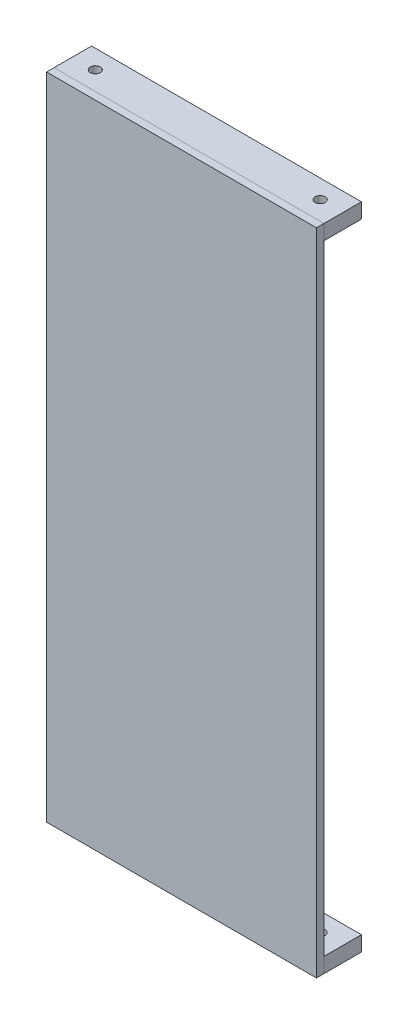
ISO-10303-21;
HEADER;
FILE_DESCRIPTION(('STEP AP214'),'2;1');
FILE_NAME('part.step','',(''),(''),'','','');
FILE_SCHEMA(('AUTOMOTIVE_DESIGN { 1 0 10303 214 1 1 1 1 }'));
ENDSEC;
DATA;
#1=APPLICATION_CONTEXT('core data for automotive mechanical design processes');
#2=APPLICATION_PROTOCOL_DEFINITION('international standard','automotive_design',2000,#1);
#3=PRODUCT_CONTEXT('',#1,'mechanical');
#4=PRODUCT('Part','Part','',(#3));
#5=PRODUCT_RELATED_PRODUCT_CATEGORY('part','',(#4));
#6=PRODUCT_DEFINITION_FORMATION('','',#4);
#7=PRODUCT_DEFINITION_CONTEXT('part definition',#1,'design');
#8=PRODUCT_DEFINITION('design','',#6,#7);
#9=PRODUCT_DEFINITION_SHAPE('','',#8);
#10=(LENGTH_UNIT() NAMED_UNIT(*) SI_UNIT(.MILLI.,.METRE.));
#11=(NAMED_UNIT(*) PLANE_ANGLE_UNIT() SI_UNIT($,.RADIAN.));
#12=(NAMED_UNIT(*) SI_UNIT($,.STERADIAN.) SOLID_ANGLE_UNIT());
#13=UNCERTAINTY_MEASURE_WITH_UNIT(LENGTH_MEASURE(1.E-05),#10,'distance_accuracy_value','');
#14=(GEOMETRIC_REPRESENTATION_CONTEXT(3) GLOBAL_UNCERTAINTY_ASSIGNED_CONTEXT((#13)) GLOBAL_UNIT_ASSIGNED_CONTEXT((#10,
#11,#12)) REPRESENTATION_CONTEXT('',''));
#15=CARTESIAN_POINT('',(0.,0.,0.));
#16=DIRECTION('',(0.,0.,1.));
#17=DIRECTION('',(1.,0.,0.));
#18=AXIS2_PLACEMENT_3D('',#15,#16,#17);
#19=CARTESIAN_POINT('',(54.,-130.,-1.5));
#20=DIRECTION('',(1.,0.,0.));
#21=DIRECTION('',(0.,0.,-1.));
#22=AXIS2_PLACEMENT_3D('',#19,#20,#21);
#23=PLANE('',#22);
#24=DIRECTION('',(0.,0.,-1.));
#25=VECTOR('',#24,1.);
#26=CARTESIAN_POINT('',(54.,-124.,-1.5));
#27=LINE('',#26,#25);
#28=CARTESIAN_POINT('',(54.,-124.,-1.5));
#29=VERTEX_POINT('',#28);
#30=CARTESIAN_POINT('',(54.,-124.,-16.5));
#31=VERTEX_POINT('',#30);
#32=EDGE_CURVE('E113',#29,#31,#27,.T.);
#33=ORIENTED_EDGE('',*,*,#32,.F.);
#34=DIRECTION('',(0.,1.,0.));
#35=VECTOR('',#34,1.);
#36=CARTESIAN_POINT('',(54.,-130.,-1.5));
#37=LINE('',#36,#35);
#38=CARTESIAN_POINT('',(54.,-130.,-1.5));
#39=VERTEX_POINT('',#38);
#40=EDGE_CURVE('E12',#39,#29,#37,.T.);
#41=ORIENTED_EDGE('',*,*,#40,.F.);
#42=DIRECTION('',(0.,0.,-1.));
#43=VECTOR('',#42,1.);
#44=CARTESIAN_POINT('',(54.,-130.,-1.5));
#45=LINE('',#44,#43);
#46=CARTESIAN_POINT('',(54.,-130.,-16.5));
#47=VERTEX_POINT('',#46);
#48=EDGE_CURVE('E106',#39,#47,#45,.T.);
#49=ORIENTED_EDGE('',*,*,#48,.T.);
#50=DIRECTION('',(0.,1.,0.));
#51=VECTOR('',#50,1.);
#52=CARTESIAN_POINT('',(54.,-130.,-16.5));
#53=LINE('',#52,#51);
#54=EDGE_CURVE('E51',#47,#31,#53,.T.);
#55=ORIENTED_EDGE('',*,*,#54,.T.);
#56=EDGE_LOOP('',(#33,#41,#49,#55));
#57=FACE_BOUND('',#56,.T.);
#58=ADVANCED_FACE('F48',(#57),#23,.T.);
#59=CARTESIAN_POINT('',(54.,-130.,-1.5));
#60=DIRECTION('',(0.,0.,1.));
#61=DIRECTION('',(1.,0.,0.));
#62=AXIS2_PLACEMENT_3D('',#59,#60,#61);
#63=PLANE('',#62);
#64=DIRECTION('',(1.,0.,0.));
#65=VECTOR('',#64,1.);
#66=CARTESIAN_POINT('',(54.,-124.,-1.5));
#67=LINE('',#66,#65);
#68=CARTESIAN_POINT('',(-54.,-124.,-1.49999999999999));
#69=VERTEX_POINT('',#68);
#70=EDGE_CURVE('E108',#69,#29,#67,.T.);
#71=ORIENTED_EDGE('',*,*,#70,.F.);
#72=DIRECTION('',(0.,1.,0.));
#73=VECTOR('',#72,1.);
#74=CARTESIAN_POINT('',(-54.,-130.,-1.49999999999999));
#75=LINE('',#74,#73);
#76=CARTESIAN_POINT('',(-54.,-130.,-1.49999999999999));
#77=VERTEX_POINT('',#76);
#78=EDGE_CURVE('E57',#77,#69,#75,.T.);
#79=ORIENTED_EDGE('',*,*,#78,.F.);
#80=DIRECTION('',(1.,0.,0.));
#81=VECTOR('',#80,1.);
#82=CARTESIAN_POINT('',(54.,-130.,-1.5));
#83=LINE('',#82,#81);
#84=EDGE_CURVE('E103',#77,#39,#83,.T.);
#85=ORIENTED_EDGE('',*,*,#84,.T.);
#86=ORIENTED_EDGE('',*,*,#40,.T.);
#87=EDGE_LOOP('',(#71,#79,#85,#86));
#88=FACE_BOUND('',#87,.T.);
#89=ADVANCED_FACE('F124',(#88),#63,.T.);
#90=CARTESIAN_POINT('',(-54.,-130.,-1.49999999999999));
#91=DIRECTION('',(-1.,0.,0.));
#92=DIRECTION('',(0.,0.,1.));
#93=AXIS2_PLACEMENT_3D('',#90,#91,#92);
#94=PLANE('',#93);
#95=DIRECTION('',(0.,0.,1.));
#96=VECTOR('',#95,1.);
#97=CARTESIAN_POINT('',(-54.,-124.,-1.49999999999999));
#98=LINE('',#97,#96);
#99=CARTESIAN_POINT('',(-54.,-124.,-16.5));
#100=VERTEX_POINT('',#99);
#101=EDGE_CURVE('E98',#100,#69,#98,.T.);
#102=ORIENTED_EDGE('',*,*,#101,.F.);
#103=DIRECTION('',(0.,1.,0.));
#104=VECTOR('',#103,1.);
#105=CARTESIAN_POINT('',(-54.,-130.,-16.5));
#106=LINE('',#105,#104);
#107=CARTESIAN_POINT('',(-54.,-130.,-16.5));
#108=VERTEX_POINT('',#107);
#109=EDGE_CURVE('E93',#108,#100,#106,.T.);
#110=ORIENTED_EDGE('',*,*,#109,.F.);
#111=DIRECTION('',(0.,0.,1.));
#112=VECTOR('',#111,1.);
#113=CARTESIAN_POINT('',(-54.,-130.,-1.49999999999999));
#114=LINE('',#113,#112);
#115=EDGE_CURVE('E96',#108,#77,#114,.T.);
#116=ORIENTED_EDGE('',*,*,#115,.T.);
#117=ORIENTED_EDGE('',*,*,#78,.T.);
#118=EDGE_LOOP('',(#102,#110,#116,#117));
#119=FACE_BOUND('',#118,.T.);
#120=ADVANCED_FACE('F95',(#119),#94,.T.);
#121=CARTESIAN_POINT('',(54.,-130.,-16.5));
#122=DIRECTION('',(0.,0.,-1.));
#123=DIRECTION('',(-1.,0.,0.));
#124=AXIS2_PLACEMENT_3D('',#121,#122,#123);
#125=PLANE('',#124);
#126=DIRECTION('',(-1.,0.,0.));
#127=VECTOR('',#126,1.);
#128=CARTESIAN_POINT('',(54.,-124.,-16.5));
#129=LINE('',#128,#127);
#130=EDGE_CURVE('E116',#31,#100,#129,.T.);
#131=ORIENTED_EDGE('',*,*,#130,.F.);
#132=ORIENTED_EDGE('',*,*,#54,.F.);
#133=DIRECTION('',(-1.,0.,0.));
#134=VECTOR('',#133,1.);
#135=CARTESIAN_POINT('',(54.,-130.,-16.5));
#136=LINE('',#135,#134);
#137=EDGE_CURVE('E102',#47,#108,#136,.T.);
#138=ORIENTED_EDGE('',*,*,#137,.T.);
#139=ORIENTED_EDGE('',*,*,#109,.T.);
#140=EDGE_LOOP('',(#131,#132,#138,#139));
#141=FACE_BOUND('',#140,.T.);
#142=ADVANCED_FACE('F105',(#141),#125,.T.);
#143=CARTESIAN_POINT('',(0.,-130.,0.));
#144=DIRECTION('',(0.,1.,0.));
#145=DIRECTION('',(0.,0.,1.));
#146=AXIS2_PLACEMENT_3D('',#143,#144,#145);
#147=PLANE('',#146);
#148=CARTESIAN_POINT('',(-45.,-130.,-8.99999999999999));
#149=DIRECTION('',(0.,1.,0.));
#150=DIRECTION('',(0.,0.,1.));
#151=AXIS2_PLACEMENT_3D('',#148,#149,#150);
#152=CIRCLE('',#151,2.);
#153=CARTESIAN_POINT('',(-45.,-130.,-6.99999999999999));
#154=VERTEX_POINT('',#153);
#155=EDGE_CURVE('E157',#154,#154,#152,.T.);
#156=ORIENTED_EDGE('',*,*,#155,.T.);
#157=EDGE_LOOP('',(#156));
#158=FACE_BOUND('',#157,.T.);
#159=CARTESIAN_POINT('',(45.,-130.,-9.));
#160=DIRECTION('',(0.,1.,0.));
#161=DIRECTION('',(0.,0.,1.));
#162=AXIS2_PLACEMENT_3D('',#159,#160,#161);
#163=CIRCLE('',#162,2.);
#164=CARTESIAN_POINT('',(45.,-130.,-7.));
#165=VERTEX_POINT('',#164);
#166=EDGE_CURVE('E117',#165,#165,#163,.T.);
#167=ORIENTED_EDGE('',*,*,#166,.T.);
#168=EDGE_LOOP('',(#167));
#169=FACE_BOUND('',#168,.T.);
#170=ORIENTED_EDGE('',*,*,#48,.F.);
#171=ORIENTED_EDGE('',*,*,#84,.F.);
#172=ORIENTED_EDGE('',*,*,#115,.F.);
#173=ORIENTED_EDGE('',*,*,#137,.F.);
#174=EDGE_LOOP('',(#170,#171,#172,#173));
#175=FACE_BOUND('',#174,.T.);
#176=ADVANCED_FACE('F101',(#158,#169,#175),#147,.F.);
#177=CARTESIAN_POINT('',(0.,-124.,0.));
#178=DIRECTION('',(0.,1.,0.));
#179=DIRECTION('',(0.,0.,1.));
#180=AXIS2_PLACEMENT_3D('',#177,#178,#179);
#181=PLANE('',#180);
#182=CARTESIAN_POINT('',(-45.,-124.,-8.99999999999999));
#183=DIRECTION('',(0.,1.,0.));
#184=DIRECTION('',(0.,0.,1.));
#185=AXIS2_PLACEMENT_3D('',#182,#183,#184);
#186=CIRCLE('',#185,2.);
#187=CARTESIAN_POINT('',(-45.,-124.,-6.99999999999999));
#188=VERTEX_POINT('',#187);
#189=EDGE_CURVE('E160',#188,#188,#186,.T.);
#190=ORIENTED_EDGE('',*,*,#189,.F.);
#191=EDGE_LOOP('',(#190));
#192=FACE_BOUND('',#191,.T.);
#193=CARTESIAN_POINT('',(45.,-124.,-9.));
#194=DIRECTION('',(0.,1.,0.));
#195=DIRECTION('',(0.,0.,1.));
#196=AXIS2_PLACEMENT_3D('',#193,#194,#195);
#197=CIRCLE('',#196,2.);
#198=CARTESIAN_POINT('',(45.,-124.,-7.));
#199=VERTEX_POINT('',#198);
#200=EDGE_CURVE('E162',#199,#199,#197,.T.);
#201=ORIENTED_EDGE('',*,*,#200,.F.);
#202=EDGE_LOOP('',(#201));
#203=FACE_BOUND('',#202,.T.);
#204=ORIENTED_EDGE('',*,*,#32,.T.);
#205=ORIENTED_EDGE('',*,*,#130,.T.);
#206=ORIENTED_EDGE('',*,*,#101,.T.);
#207=ORIENTED_EDGE('',*,*,#70,.T.);
#208=EDGE_LOOP('',(#204,#205,#206,#207));
#209=FACE_BOUND('',#208,.T.);
#210=ADVANCED_FACE('F123',(#192,#203,#209),#181,.T.);
#211=CARTESIAN_POINT('',(45.,-130.,-9.));
#212=DIRECTION('',(0.,1.,0.));
#213=DIRECTION('',(0.,0.,1.));
#214=AXIS2_PLACEMENT_3D('',#211,#212,#213);
#215=CYLINDRICAL_SURFACE('',#214,2.);
#216=ORIENTED_EDGE('',*,*,#166,.F.);
#217=EDGE_LOOP('',(#216));
#218=FACE_BOUND('',#217,.T.);
#219=ORIENTED_EDGE('',*,*,#200,.T.);
#220=EDGE_LOOP('',(#219));
#221=FACE_BOUND('',#220,.T.);
#222=ADVANCED_FACE('F142',(#218,#221),#215,.F.);
#223=CARTESIAN_POINT('',(-45.,-130.,-8.99999999999999));
#224=DIRECTION('',(0.,1.,0.));
#225=DIRECTION('',(0.,0.,1.));
#226=AXIS2_PLACEMENT_3D('',#223,#224,#225);
#227=CYLINDRICAL_SURFACE('',#226,2.);
#228=ORIENTED_EDGE('',*,*,#155,.F.);
#229=EDGE_LOOP('',(#228));
#230=FACE_BOUND('',#229,.T.);
#231=ORIENTED_EDGE('',*,*,#189,.T.);
#232=EDGE_LOOP('',(#231));
#233=FACE_BOUND('',#232,.T.);
#234=ADVANCED_FACE('F149',(#230,#233),#227,.F.);
#235=CLOSED_SHELL('',(#58,#89,#120,#142,#176,#210,#222,#234));
#236=MANIFOLD_SOLID_BREP('B2',#235);
#237=CARTESIAN_POINT('',(54.,124.,-1.5));
#238=DIRECTION('',(1.,0.,0.));
#239=DIRECTION('',(0.,0.,-1.));
#240=AXIS2_PLACEMENT_3D('',#237,#238,#239);
#241=PLANE('',#240);
#242=DIRECTION('',(0.,0.,-1.));
#243=VECTOR('',#242,1.);
#244=CARTESIAN_POINT('',(54.,130.,-1.5));
#245=LINE('',#244,#243);
#246=CARTESIAN_POINT('',(54.,130.,-1.5));
#247=VERTEX_POINT('',#246);
#248=CARTESIAN_POINT('',(54.,130.,-16.5));
#249=VERTEX_POINT('',#248);
#250=EDGE_CURVE('E288',#247,#249,#245,.T.);
#251=ORIENTED_EDGE('',*,*,#250,.F.);
#252=DIRECTION('',(0.,1.,0.));
#253=VECTOR('',#252,1.);
#254=CARTESIAN_POINT('',(54.,124.,-1.5));
#255=LINE('',#254,#253);
#256=CARTESIAN_POINT('',(54.,124.,-1.5));
#257=VERTEX_POINT('',#256);
#258=EDGE_CURVE('E46',#257,#247,#255,.T.);
#259=ORIENTED_EDGE('',*,*,#258,.F.);
#260=DIRECTION('',(0.,0.,-1.));
#261=VECTOR('',#260,1.);
#262=CARTESIAN_POINT('',(54.,124.,-1.5));
#263=LINE('',#262,#261);
#264=CARTESIAN_POINT('',(54.,124.,-16.5));
#265=VERTEX_POINT('',#264);
#266=EDGE_CURVE('E281',#257,#265,#263,.T.);
#267=ORIENTED_EDGE('',*,*,#266,.T.);
#268=DIRECTION('',(0.,1.,0.));
#269=VECTOR('',#268,1.);
#270=CARTESIAN_POINT('',(54.,124.,-16.5));
#271=LINE('',#270,#269);
#272=EDGE_CURVE('E226',#265,#249,#271,.T.);
#273=ORIENTED_EDGE('',*,*,#272,.T.);
#274=EDGE_LOOP('',(#251,#259,#267,#273));
#275=FACE_BOUND('',#274,.T.);
#276=ADVANCED_FACE('F223',(#275),#241,.T.);
#277=CARTESIAN_POINT('',(54.,124.,-1.5));
#278=DIRECTION('',(0.,0.,1.));
#279=DIRECTION('',(1.,0.,0.));
#280=AXIS2_PLACEMENT_3D('',#277,#278,#279);
#281=PLANE('',#280);
#282=DIRECTION('',(1.,0.,0.));
#283=VECTOR('',#282,1.);
#284=CARTESIAN_POINT('',(54.,130.,-1.5));
#285=LINE('',#284,#283);
#286=CARTESIAN_POINT('',(-54.,130.,-1.49999999999999));
#287=VERTEX_POINT('',#286);
#288=EDGE_CURVE('E283',#287,#247,#285,.T.);
#289=ORIENTED_EDGE('',*,*,#288,.F.);
#290=DIRECTION('',(0.,1.,0.));
#291=VECTOR('',#290,1.);
#292=CARTESIAN_POINT('',(-54.,124.,-1.49999999999999));
#293=LINE('',#292,#291);
#294=CARTESIAN_POINT('',(-54.,124.,-1.49999999999999));
#295=VERTEX_POINT('',#294);
#296=EDGE_CURVE('E232',#295,#287,#293,.T.);
#297=ORIENTED_EDGE('',*,*,#296,.F.);
#298=DIRECTION('',(1.,0.,0.));
#299=VECTOR('',#298,1.);
#300=CARTESIAN_POINT('',(54.,124.,-1.5));
#301=LINE('',#300,#299);
#302=EDGE_CURVE('E278',#295,#257,#301,.T.);
#303=ORIENTED_EDGE('',*,*,#302,.T.);
#304=ORIENTED_EDGE('',*,*,#258,.T.);
#305=EDGE_LOOP('',(#289,#297,#303,#304));
#306=FACE_BOUND('',#305,.T.);
#307=ADVANCED_FACE('F299',(#306),#281,.T.);
#308=CARTESIAN_POINT('',(-54.,124.,-1.49999999999999));
#309=DIRECTION('',(-1.,0.,0.));
#310=DIRECTION('',(0.,0.,1.));
#311=AXIS2_PLACEMENT_3D('',#308,#309,#310);
#312=PLANE('',#311);
#313=DIRECTION('',(0.,0.,1.));
#314=VECTOR('',#313,1.);
#315=CARTESIAN_POINT('',(-54.,130.,-1.49999999999999));
#316=LINE('',#315,#314);
#317=CARTESIAN_POINT('',(-54.,130.,-16.5));
#318=VERTEX_POINT('',#317);
#319=EDGE_CURVE('E273',#318,#287,#316,.T.);
#320=ORIENTED_EDGE('',*,*,#319,.F.);
#321=DIRECTION('',(0.,1.,0.));
#322=VECTOR('',#321,1.);
#323=CARTESIAN_POINT('',(-54.,124.,-16.5));
#324=LINE('',#323,#322);
#325=CARTESIAN_POINT('',(-54.,124.,-16.5));
#326=VERTEX_POINT('',#325);
#327=EDGE_CURVE('E268',#326,#318,#324,.T.);
#328=ORIENTED_EDGE('',*,*,#327,.F.);
#329=DIRECTION('',(0.,0.,1.));
#330=VECTOR('',#329,1.);
#331=CARTESIAN_POINT('',(-54.,124.,-1.49999999999999));
#332=LINE('',#331,#330);
#333=EDGE_CURVE('E271',#326,#295,#332,.T.);
#334=ORIENTED_EDGE('',*,*,#333,.T.);
#335=ORIENTED_EDGE('',*,*,#296,.T.);
#336=EDGE_LOOP('',(#320,#328,#334,#335));
#337=FACE_BOUND('',#336,.T.);
#338=ADVANCED_FACE('F270',(#337),#312,.T.);
#339=CARTESIAN_POINT('',(54.,124.,-16.5));
#340=DIRECTION('',(0.,0.,-1.));
#341=DIRECTION('',(-1.,0.,0.));
#342=AXIS2_PLACEMENT_3D('',#339,#340,#341);
#343=PLANE('',#342);
#344=DIRECTION('',(-1.,0.,0.));
#345=VECTOR('',#344,1.);
#346=CARTESIAN_POINT('',(54.,130.,-16.5));
#347=LINE('',#346,#345);
#348=EDGE_CURVE('E291',#249,#318,#347,.T.);
#349=ORIENTED_EDGE('',*,*,#348,.F.);
#350=ORIENTED_EDGE('',*,*,#272,.F.);
#351=DIRECTION('',(-1.,0.,0.));
#352=VECTOR('',#351,1.);
#353=CARTESIAN_POINT('',(54.,124.,-16.5));
#354=LINE('',#353,#352);
#355=EDGE_CURVE('E277',#265,#326,#354,.T.);
#356=ORIENTED_EDGE('',*,*,#355,.T.);
#357=ORIENTED_EDGE('',*,*,#327,.T.);
#358=EDGE_LOOP('',(#349,#350,#356,#357));
#359=FACE_BOUND('',#358,.T.);
#360=ADVANCED_FACE('F280',(#359),#343,.T.);
#361=CARTESIAN_POINT('',(0.,124.,0.));
#362=DIRECTION('',(0.,1.,0.));
#363=DIRECTION('',(0.,0.,1.));
#364=AXIS2_PLACEMENT_3D('',#361,#362,#363);
#365=PLANE('',#364);
#366=CARTESIAN_POINT('',(-45.,124.,-8.99999999999999));
#367=DIRECTION('',(0.,1.,0.));
#368=DIRECTION('',(0.,0.,1.));
#369=AXIS2_PLACEMENT_3D('',#366,#367,#368);
#370=CIRCLE('',#369,2.);
#371=CARTESIAN_POINT('',(-45.,124.,-6.99999999999999));
#372=VERTEX_POINT('',#371);
#373=EDGE_CURVE('E332',#372,#372,#370,.T.);
#374=ORIENTED_EDGE('',*,*,#373,.T.);
#375=EDGE_LOOP('',(#374));
#376=FACE_BOUND('',#375,.T.);
#377=CARTESIAN_POINT('',(45.,124.,-9.));
#378=DIRECTION('',(0.,1.,0.));
#379=DIRECTION('',(0.,0.,1.));
#380=AXIS2_PLACEMENT_3D('',#377,#378,#379);
#381=CIRCLE('',#380,2.);
#382=CARTESIAN_POINT('',(45.,124.,-7.));
#383=VERTEX_POINT('',#382);
#384=EDGE_CURVE('E292',#383,#383,#381,.T.);
#385=ORIENTED_EDGE('',*,*,#384,.T.);
#386=EDGE_LOOP('',(#385));
#387=FACE_BOUND('',#386,.T.);
#388=ORIENTED_EDGE('',*,*,#266,.F.);
#389=ORIENTED_EDGE('',*,*,#302,.F.);
#390=ORIENTED_EDGE('',*,*,#333,.F.);
#391=ORIENTED_EDGE('',*,*,#355,.F.);
#392=EDGE_LOOP('',(#388,#389,#390,#391));
#393=FACE_BOUND('',#392,.T.);
#394=ADVANCED_FACE('F276',(#376,#387,#393),#365,.F.);
#395=CARTESIAN_POINT('',(0.,130.,0.));
#396=DIRECTION('',(0.,1.,0.));
#397=DIRECTION('',(0.,0.,1.));
#398=AXIS2_PLACEMENT_3D('',#395,#396,#397);
#399=PLANE('',#398);
#400=CARTESIAN_POINT('',(-45.,130.,-8.99999999999999));
#401=DIRECTION('',(0.,1.,0.));
#402=DIRECTION('',(0.,0.,1.));
#403=AXIS2_PLACEMENT_3D('',#400,#401,#402);
#404=CIRCLE('',#403,2.);
#405=CARTESIAN_POINT('',(-45.,130.,-6.99999999999999));
#406=VERTEX_POINT('',#405);
#407=EDGE_CURVE('E335',#406,#406,#404,.T.);
#408=ORIENTED_EDGE('',*,*,#407,.F.);
#409=EDGE_LOOP('',(#408));
#410=FACE_BOUND('',#409,.T.);
#411=CARTESIAN_POINT('',(45.,130.,-9.));
#412=DIRECTION('',(0.,1.,0.));
#413=DIRECTION('',(0.,0.,1.));
#414=AXIS2_PLACEMENT_3D('',#411,#412,#413);
#415=CIRCLE('',#414,2.);
#416=CARTESIAN_POINT('',(45.,130.,-7.));
#417=VERTEX_POINT('',#416);
#418=EDGE_CURVE('E337',#417,#417,#415,.T.);
#419=ORIENTED_EDGE('',*,*,#418,.F.);
#420=EDGE_LOOP('',(#419));
#421=FACE_BOUND('',#420,.T.);
#422=ORIENTED_EDGE('',*,*,#250,.T.);
#423=ORIENTED_EDGE('',*,*,#348,.T.);
#424=ORIENTED_EDGE('',*,*,#319,.T.);
#425=ORIENTED_EDGE('',*,*,#288,.T.);
#426=EDGE_LOOP('',(#422,#423,#424,#425));
#427=FACE_BOUND('',#426,.T.);
#428=ADVANCED_FACE('F298',(#410,#421,#427),#399,.T.);
#429=CARTESIAN_POINT('',(45.,124.,-9.));
#430=DIRECTION('',(0.,1.,0.));
#431=DIRECTION('',(0.,0.,1.));
#432=AXIS2_PLACEMENT_3D('',#429,#430,#431);
#433=CYLINDRICAL_SURFACE('',#432,2.);
#434=ORIENTED_EDGE('',*,*,#384,.F.);
#435=EDGE_LOOP('',(#434));
#436=FACE_BOUND('',#435,.T.);
#437=ORIENTED_EDGE('',*,*,#418,.T.);
#438=EDGE_LOOP('',(#437));
#439=FACE_BOUND('',#438,.T.);
#440=ADVANCED_FACE('F317',(#436,#439),#433,.F.);
#441=CARTESIAN_POINT('',(-45.,124.,-8.99999999999999));
#442=DIRECTION('',(0.,1.,0.));
#443=DIRECTION('',(0.,0.,1.));
#444=AXIS2_PLACEMENT_3D('',#441,#442,#443);
#445=CYLINDRICAL_SURFACE('',#444,2.);
#446=ORIENTED_EDGE('',*,*,#373,.F.);
#447=EDGE_LOOP('',(#446));
#448=FACE_BOUND('',#447,.T.);
#449=ORIENTED_EDGE('',*,*,#407,.T.);
#450=EDGE_LOOP('',(#449));
#451=FACE_BOUND('',#450,.T.);
#452=ADVANCED_FACE('F324',(#448,#451),#445,.F.);
#453=CLOSED_SHELL('',(#276,#307,#338,#360,#394,#428,#440,#452));
#454=MANIFOLD_SOLID_BREP('B6',#453);
#455=CARTESIAN_POINT('',(-54.,-130.,-1.5));
#456=DIRECTION('',(-1.,0.,0.));
#457=DIRECTION('',(0.,0.,1.));
#458=AXIS2_PLACEMENT_3D('',#455,#456,#457);
#459=PLANE('',#458);
#460=DIRECTION('',(0.,0.,1.));
#461=VECTOR('',#460,1.);
#462=CARTESIAN_POINT('',(-54.,-130.,-1.5));
#463=LINE('',#462,#461);
#464=CARTESIAN_POINT('',(-54.,-130.,-1.5));
#465=VERTEX_POINT('',#464);
#466=CARTESIAN_POINT('',(-54.,-130.,1.5));
#467=VERTEX_POINT('',#466);
#468=EDGE_CURVE('E392',#465,#467,#463,.T.);
#469=ORIENTED_EDGE('',*,*,#468,.T.);
#470=DIRECTION('',(0.,-1.,0.));
#471=VECTOR('',#470,1.);
#472=CARTESIAN_POINT('',(-54.,-130.,1.5));
#473=LINE('',#472,#471);
#474=CARTESIAN_POINT('',(-54.,130.,1.5));
#475=VERTEX_POINT('',#474);
#476=EDGE_CURVE('E429',#475,#467,#473,.T.);
#477=ORIENTED_EDGE('',*,*,#476,.F.);
#478=DIRECTION('',(0.,0.,1.));
#479=VECTOR('',#478,1.);
#480=CARTESIAN_POINT('',(-54.,130.,-1.5));
#481=LINE('',#480,#479);
#482=CARTESIAN_POINT('',(-54.,130.,-1.5));
#483=VERTEX_POINT('',#482);
#484=EDGE_CURVE('E221',#483,#475,#481,.T.);
#485=ORIENTED_EDGE('',*,*,#484,.F.);
#486=DIRECTION('',(0.,-1.,0.));
#487=VECTOR('',#486,1.);
#488=CARTESIAN_POINT('',(-54.,-130.,-1.5));
#489=LINE('',#488,#487);
#490=EDGE_CURVE('E430',#483,#465,#489,.T.);
#491=ORIENTED_EDGE('',*,*,#490,.T.);
#492=EDGE_LOOP('',(#469,#477,#485,#491));
#493=FACE_BOUND('',#492,.T.);
#494=ADVANCED_FACE('F389',(#493),#459,.T.);
#495=CARTESIAN_POINT('',(-54.,130.,-1.5));
#496=DIRECTION('',(0.,1.,0.));
#497=DIRECTION('',(0.,0.,1.));
#498=AXIS2_PLACEMENT_3D('',#495,#496,#497);
#499=PLANE('',#498);
#500=ORIENTED_EDGE('',*,*,#484,.T.);
#501=DIRECTION('',(-1.,0.,0.));
#502=VECTOR('',#501,1.);
#503=CARTESIAN_POINT('',(-54.,130.,1.5));
#504=LINE('',#503,#502);
#505=CARTESIAN_POINT('',(54.,130.,1.5));
#506=VERTEX_POINT('',#505);
#507=EDGE_CURVE('E446',#506,#475,#504,.T.);
#508=ORIENTED_EDGE('',*,*,#507,.F.);
#509=DIRECTION('',(0.,0.,1.));
#510=VECTOR('',#509,1.);
#511=CARTESIAN_POINT('',(54.,130.,-1.5));
#512=LINE('',#511,#510);
#513=CARTESIAN_POINT('',(54.,130.,-1.5));
#514=VERTEX_POINT('',#513);
#515=EDGE_CURVE('E397',#514,#506,#512,.T.);
#516=ORIENTED_EDGE('',*,*,#515,.F.);
#517=DIRECTION('',(-1.,0.,0.));
#518=VECTOR('',#517,1.);
#519=CARTESIAN_POINT('',(-54.,130.,-1.5));
#520=LINE('',#519,#518);
#521=EDGE_CURVE('E435',#514,#483,#520,.T.);
#522=ORIENTED_EDGE('',*,*,#521,.T.);
#523=EDGE_LOOP('',(#500,#508,#516,#522));
#524=FACE_BOUND('',#523,.T.);
#525=ADVANCED_FACE('F461',(#524),#499,.T.);
#526=CARTESIAN_POINT('',(54.,-130.,-1.5));
#527=DIRECTION('',(1.,0.,0.));
#528=DIRECTION('',(0.,0.,-1.));
#529=AXIS2_PLACEMENT_3D('',#526,#527,#528);
#530=PLANE('',#529);
#531=ORIENTED_EDGE('',*,*,#515,.T.);
#532=DIRECTION('',(0.,1.,0.));
#533=VECTOR('',#532,1.);
#534=CARTESIAN_POINT('',(54.,-130.,1.5));
#535=LINE('',#534,#533);
#536=CARTESIAN_POINT('',(54.,-130.,1.5));
#537=VERTEX_POINT('',#536);
#538=EDGE_CURVE('E442',#537,#506,#535,.T.);
#539=ORIENTED_EDGE('',*,*,#538,.F.);
#540=DIRECTION('',(0.,0.,1.));
#541=VECTOR('',#540,1.);
#542=CARTESIAN_POINT('',(54.,-130.,-1.5));
#543=LINE('',#542,#541);
#544=CARTESIAN_POINT('',(54.,-130.,-1.5));
#545=VERTEX_POINT('',#544);
#546=EDGE_CURVE('E434',#545,#537,#543,.T.);
#547=ORIENTED_EDGE('',*,*,#546,.F.);
#548=DIRECTION('',(0.,1.,0.));
#549=VECTOR('',#548,1.);
#550=CARTESIAN_POINT('',(54.,-130.,-1.5));
#551=LINE('',#550,#549);
#552=EDGE_CURVE('E454',#545,#514,#551,.T.);
#553=ORIENTED_EDGE('',*,*,#552,.T.);
#554=EDGE_LOOP('',(#531,#539,#547,#553));
#555=FACE_BOUND('',#554,.T.);
#556=ADVANCED_FACE('F458',(#555),#530,.T.);
#557=CARTESIAN_POINT('',(-54.,-130.,-1.5));
#558=DIRECTION('',(0.,-1.,0.));
#559=DIRECTION('',(0.,0.,-1.));
#560=AXIS2_PLACEMENT_3D('',#557,#558,#559);
#561=PLANE('',#560);
#562=ORIENTED_EDGE('',*,*,#546,.T.);
#563=DIRECTION('',(1.,0.,0.));
#564=VECTOR('',#563,1.);
#565=CARTESIAN_POINT('',(-54.,-130.,1.5));
#566=LINE('',#565,#564);
#567=EDGE_CURVE('E437',#467,#537,#566,.T.);
#568=ORIENTED_EDGE('',*,*,#567,.F.);
#569=ORIENTED_EDGE('',*,*,#468,.F.);
#570=DIRECTION('',(1.,0.,0.));
#571=VECTOR('',#570,1.);
#572=CARTESIAN_POINT('',(-54.,-130.,-1.5));
#573=LINE('',#572,#571);
#574=EDGE_CURVE('E452',#465,#545,#573,.T.);
#575=ORIENTED_EDGE('',*,*,#574,.T.);
#576=EDGE_LOOP('',(#562,#568,#569,#575));
#577=FACE_BOUND('',#576,.T.);
#578=ADVANCED_FACE('F438',(#577),#561,.T.);
#579=CARTESIAN_POINT('',(0.,0.,-1.5));
#580=DIRECTION('',(0.,0.,-1.));
#581=DIRECTION('',(-1.,0.,0.));
#582=AXIS2_PLACEMENT_3D('',#579,#580,#581);
#583=PLANE('',#582);
#584=ORIENTED_EDGE('',*,*,#490,.F.);
#585=ORIENTED_EDGE('',*,*,#521,.F.);
#586=ORIENTED_EDGE('',*,*,#552,.F.);
#587=ORIENTED_EDGE('',*,*,#574,.F.);
#588=EDGE_LOOP('',(#584,#585,#586,#587));
#589=FACE_BOUND('',#588,.T.);
#590=ADVANCED_FACE('F463',(#589),#583,.T.);
#591=CARTESIAN_POINT('',(0.,0.,1.5));
#592=DIRECTION('',(0.,0.,-1.));
#593=DIRECTION('',(-1.,0.,0.));
#594=AXIS2_PLACEMENT_3D('',#591,#592,#593);
#595=PLANE('',#594);
#596=ORIENTED_EDGE('',*,*,#476,.T.);
#597=ORIENTED_EDGE('',*,*,#567,.T.);
#598=ORIENTED_EDGE('',*,*,#538,.T.);
#599=ORIENTED_EDGE('',*,*,#507,.T.);
#600=EDGE_LOOP('',(#596,#597,#598,#599));
#601=FACE_BOUND('',#600,.T.);
#602=ADVANCED_FACE('F445',(#601),#595,.F.);
#603=CLOSED_SHELL('',(#494,#525,#556,#578,#590,#602));
#604=MANIFOLD_SOLID_BREP('B40',#603);
#605=ADVANCED_BREP_SHAPE_REPRESENTATION('',(#18,#236,#454,#604),#14);
#606=SHAPE_DEFINITION_REPRESENTATION(#9,#605);
ENDSEC;
END-ISO-10303-21;
